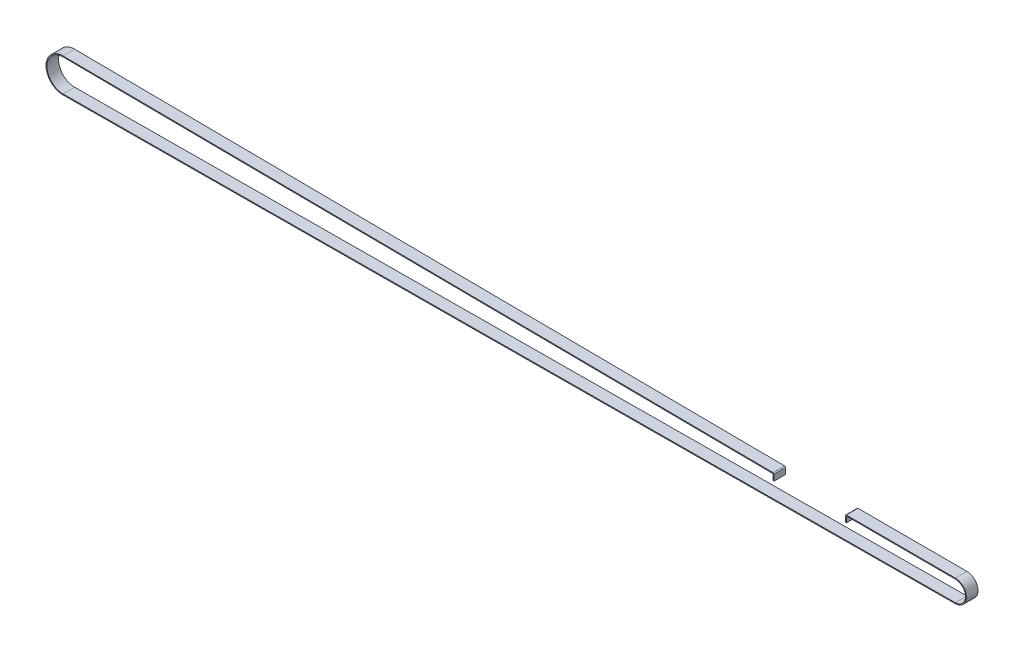
ISO-10303-21;
HEADER;
FILE_DESCRIPTION(('STEP AP214'),'2;1');
FILE_NAME('part.step','',(''),(''),'','','');
FILE_SCHEMA(('AUTOMOTIVE_DESIGN { 1 0 10303 214 1 1 1 1 }'));
ENDSEC;
DATA;
#1=APPLICATION_CONTEXT('core data for automotive mechanical design processes');
#2=APPLICATION_PROTOCOL_DEFINITION('international standard','automotive_design',2000,#1);
#3=PRODUCT_CONTEXT('',#1,'mechanical');
#4=PRODUCT('Part','Part','',(#3));
#5=PRODUCT_RELATED_PRODUCT_CATEGORY('part','',(#4));
#6=PRODUCT_DEFINITION_FORMATION('','',#4);
#7=PRODUCT_DEFINITION_CONTEXT('part definition',#1,'design');
#8=PRODUCT_DEFINITION('design','',#6,#7);
#9=PRODUCT_DEFINITION_SHAPE('','',#8);
#10=(LENGTH_UNIT() NAMED_UNIT(*) SI_UNIT(.MILLI.,.METRE.));
#11=(NAMED_UNIT(*) PLANE_ANGLE_UNIT() SI_UNIT($,.RADIAN.));
#12=(NAMED_UNIT(*) SI_UNIT($,.STERADIAN.) SOLID_ANGLE_UNIT());
#13=UNCERTAINTY_MEASURE_WITH_UNIT(LENGTH_MEASURE(1.E-05),#10,'distance_accuracy_value','');
#14=(GEOMETRIC_REPRESENTATION_CONTEXT(3) GLOBAL_UNCERTAINTY_ASSIGNED_CONTEXT((#13)) GLOBAL_UNIT_ASSIGNED_CONTEXT((#10,
#11,#12)) REPRESENTATION_CONTEXT('',''));
#15=CARTESIAN_POINT('',(0.,0.,0.));
#16=DIRECTION('',(0.,0.,1.));
#17=DIRECTION('',(1.,0.,0.));
#18=AXIS2_PLACEMENT_3D('',#15,#16,#17);
#19=CARTESIAN_POINT('',(388.165618503053,5.41097434023567,7.35));
#20=DIRECTION('',(1.,0.,0.));
#21=DIRECTION('',(0.,1.,0.));
#22=AXIS2_PLACEMENT_3D('',#19,#20,#21);
#23=PLANE('',#22);
#24=DIRECTION('',(0.,-1.,0.));
#25=VECTOR('',#24,1.);
#26=CARTESIAN_POINT('',(388.165618503053,5.41097434023567,1.));
#27=LINE('',#26,#25);
#28=CARTESIAN_POINT('',(388.165618503053,5.41097434023567,1.));
#29=VERTEX_POINT('',#28);
#30=CARTESIAN_POINT('',(388.165618503053,2.23097434023567,1.));
#31=VERTEX_POINT('',#30);
#32=EDGE_CURVE('E202',#29,#31,#27,.T.);
#33=ORIENTED_EDGE('',*,*,#32,.T.);
#34=DIRECTION('',(0.,0.,-1.));
#35=VECTOR('',#34,1.);
#36=CARTESIAN_POINT('',(388.165618503053,2.23097434023567,7.35));
#37=LINE('',#36,#35);
#38=CARTESIAN_POINT('',(388.165618503053,2.23097434023567,7.35));
#39=VERTEX_POINT('',#38);
#40=EDGE_CURVE('E11',#39,#31,#37,.T.);
#41=ORIENTED_EDGE('',*,*,#40,.F.);
#42=DIRECTION('',(0.,-1.,0.));
#43=VECTOR('',#42,1.);
#44=CARTESIAN_POINT('',(388.165618503053,5.41097434023567,7.35));
#45=LINE('',#44,#43);
#46=CARTESIAN_POINT('',(388.165618503053,5.41097434023567,7.35));
#47=VERTEX_POINT('',#46);
#48=EDGE_CURVE('E127',#47,#39,#45,.T.);
#49=ORIENTED_EDGE('',*,*,#48,.F.);
#50=DIRECTION('',(0.,0.,-1.));
#51=VECTOR('',#50,1.);
#52=CARTESIAN_POINT('',(388.165618503053,5.41097434023567,7.35));
#53=LINE('',#52,#51);
#54=EDGE_CURVE('E198',#47,#29,#53,.T.);
#55=ORIENTED_EDGE('',*,*,#54,.T.);
#56=EDGE_LOOP('',(#33,#41,#49,#55));
#57=FACE_BOUND('',#56,.T.);
#58=ADVANCED_FACE('F35',(#57),#23,.F.);
#59=CARTESIAN_POINT('',(388.665618503053,2.23097434023568,7.35));
#60=DIRECTION('',(0.,-1.,0.));
#61=DIRECTION('',(1.,0.,0.));
#62=AXIS2_PLACEMENT_3D('',#59,#60,#61);
#63=PLANE('',#62);
#64=DIRECTION('',(-1.,0.,0.));
#65=VECTOR('',#64,1.);
#66=CARTESIAN_POINT('',(388.665618503053,2.23097434023568,1.));
#67=LINE('',#66,#65);
#68=CARTESIAN_POINT('',(388.665618503053,2.23097434023568,1.));
#69=VERTEX_POINT('',#68);
#70=EDGE_CURVE('E205',#69,#31,#67,.T.);
#71=ORIENTED_EDGE('',*,*,#70,.F.);
#72=DIRECTION('',(0.,0.,-1.));
#73=VECTOR('',#72,1.);
#74=CARTESIAN_POINT('',(388.665618503053,2.23097434023568,7.35));
#75=LINE('',#74,#73);
#76=CARTESIAN_POINT('',(388.665618503053,2.23097434023568,7.35));
#77=VERTEX_POINT('',#76);
#78=EDGE_CURVE('E43',#77,#69,#75,.T.);
#79=ORIENTED_EDGE('',*,*,#78,.F.);
#80=DIRECTION('',(-1.,0.,0.));
#81=VECTOR('',#80,1.);
#82=CARTESIAN_POINT('',(388.665618503053,2.23097434023568,7.35));
#83=LINE('',#82,#81);
#84=EDGE_CURVE('E307',#77,#39,#83,.T.);
#85=ORIENTED_EDGE('',*,*,#84,.T.);
#86=ORIENTED_EDGE('',*,*,#40,.T.);
#87=EDGE_LOOP('',(#71,#79,#85,#86));
#88=FACE_BOUND('',#87,.T.);
#89=ADVANCED_FACE('F294',(#88),#63,.T.);
#90=CARTESIAN_POINT('',(388.665618503053,5.41097434023568,7.35));
#91=DIRECTION('',(1.,0.,0.));
#92=DIRECTION('',(0.,1.,0.));
#93=AXIS2_PLACEMENT_3D('',#90,#91,#92);
#94=PLANE('',#93);
#95=DIRECTION('',(0.,-1.,0.));
#96=VECTOR('',#95,1.);
#97=CARTESIAN_POINT('',(388.665618503053,5.41097434023568,1.));
#98=LINE('',#97,#96);
#99=CARTESIAN_POINT('',(388.665618503053,5.41097434023568,1.));
#100=VERTEX_POINT('',#99);
#101=EDGE_CURVE('E208',#100,#69,#98,.T.);
#102=ORIENTED_EDGE('',*,*,#101,.F.);
#103=DIRECTION('',(0.,0.,-1.));
#104=VECTOR('',#103,1.);
#105=CARTESIAN_POINT('',(388.665618503053,5.41097434023568,7.35));
#106=LINE('',#105,#104);
#107=CARTESIAN_POINT('',(388.665618503053,5.41097434023568,7.35));
#108=VERTEX_POINT('',#107);
#109=EDGE_CURVE('E284',#108,#100,#106,.T.);
#110=ORIENTED_EDGE('',*,*,#109,.F.);
#111=DIRECTION('',(0.,-1.,0.));
#112=VECTOR('',#111,1.);
#113=CARTESIAN_POINT('',(388.665618503053,5.41097434023568,7.35));
#114=LINE('',#113,#112);
#115=EDGE_CURVE('E291',#108,#77,#114,.T.);
#116=ORIENTED_EDGE('',*,*,#115,.T.);
#117=ORIENTED_EDGE('',*,*,#78,.T.);
#118=EDGE_LOOP('',(#102,#110,#116,#117));
#119=FACE_BOUND('',#118,.T.);
#120=ADVANCED_FACE('F289',(#119),#94,.T.);
#121=CARTESIAN_POINT('',(388.065618503053,5.41097434023567,7.35));
#122=DIRECTION('',(0.,0.,-1.));
#123=DIRECTION('',(-1.,0.,0.));
#124=AXIS2_PLACEMENT_3D('',#121,#122,#123);
#125=CYLINDRICAL_SURFACE('',#124,0.599999999999967);
#126=CARTESIAN_POINT('',(388.065618503053,5.41097434023567,1.));
#127=DIRECTION('',(0.,0.,1.));
#128=DIRECTION('',(1.,0.,0.));
#129=AXIS2_PLACEMENT_3D('',#126,#127,#128);
#130=CIRCLE('',#129,0.599999999999967);
#131=CARTESIAN_POINT('',(388.070626734882,6.01095343788321,1.));
#132=VERTEX_POINT('',#131);
#133=EDGE_CURVE('E211',#132,#100,#130,.F.);
#134=ORIENTED_EDGE('',*,*,#133,.F.);
#135=DIRECTION('',(0.,0.,-1.));
#136=VECTOR('',#135,1.);
#137=CARTESIAN_POINT('',(388.070626734882,6.01095343788321,7.35));
#138=LINE('',#137,#136);
#139=CARTESIAN_POINT('',(388.070626734882,6.01095343788321,7.35));
#140=VERTEX_POINT('',#139);
#141=EDGE_CURVE('E282',#140,#132,#138,.T.);
#142=ORIENTED_EDGE('',*,*,#141,.F.);
#143=CARTESIAN_POINT('',(388.065618503053,5.41097434023567,7.35));
#144=DIRECTION('',(0.,0.,1.));
#145=DIRECTION('',(1.,0.,0.));
#146=AXIS2_PLACEMENT_3D('',#143,#144,#145);
#147=CIRCLE('',#146,0.599999999999967);
#148=EDGE_CURVE('E304',#140,#108,#147,.F.);
#149=ORIENTED_EDGE('',*,*,#148,.T.);
#150=ORIENTED_EDGE('',*,*,#109,.T.);
#151=EDGE_LOOP('',(#134,#142,#149,#150));
#152=FACE_BOUND('',#151,.T.);
#153=ADVANCED_FACE('F301',(#152),#125,.T.);
#154=CARTESIAN_POINT('',(0.0640749693883614,9.24977753995013,7.35));
#155=DIRECTION('',(0.00834705304740864,0.999965162745895,0.));
#156=DIRECTION('',(-0.999965162745895,0.00834705304740864,0.));
#157=AXIS2_PLACEMENT_3D('',#154,#155,#156);
#158=PLANE('',#157);
#159=DIRECTION('',(0.999965162745895,-0.00834705304740865,0.));
#160=VECTOR('',#159,1.);
#161=CARTESIAN_POINT('',(0.0640749693883614,9.24977753995013,1.));
#162=LINE('',#161,#160);
#163=CARTESIAN_POINT('',(0.0640749730801777,9.24977807289584,1.));
#164=VERTEX_POINT('',#163);
#165=EDGE_CURVE('E214',#164,#132,#162,.T.);
#166=ORIENTED_EDGE('',*,*,#165,.F.);
#167=DIRECTION('',(0.,0.,-1.));
#168=VECTOR('',#167,1.);
#169=CARTESIAN_POINT('',(0.0640749730801777,9.24977807289584,7.35));
#170=LINE('',#169,#168);
#171=CARTESIAN_POINT('',(0.0640749730801777,9.24977807289584,7.35));
#172=VERTEX_POINT('',#171);
#173=EDGE_CURVE('E280',#172,#164,#170,.T.);
#174=ORIENTED_EDGE('',*,*,#173,.F.);
#175=DIRECTION('',(0.999965162745895,-0.00834705304740865,0.));
#176=VECTOR('',#175,1.);
#177=CARTESIAN_POINT('',(0.0640749693883614,9.24977753995013,7.35));
#178=LINE('',#177,#176);
#179=EDGE_CURVE('E309',#172,#140,#178,.T.);
#180=ORIENTED_EDGE('',*,*,#179,.T.);
#181=ORIENTED_EDGE('',*,*,#141,.T.);
#182=EDGE_LOOP('',(#166,#174,#180,#181));
#183=FACE_BOUND('',#182,.T.);
#184=ADVANCED_FACE('F375',(#183),#158,.T.);
#185=CARTESIAN_POINT('',(0.,0.,7.35));
#186=DIRECTION('',(0.,0.,-1.));
#187=DIRECTION('',(-1.,0.,0.));
#188=AXIS2_PLACEMENT_3D('',#185,#186,#187);
#189=CYLINDRICAL_SURFACE('',#188,9.25);
#190=CARTESIAN_POINT('',(0.,0.,1.));
#191=DIRECTION('',(0.,0.,1.));
#192=DIRECTION('',(1.,0.,0.));
#193=AXIS2_PLACEMENT_3D('',#190,#191,#192);
#194=CIRCLE('',#193,9.25);
#195=CARTESIAN_POINT('',(0.0575771527891216,-9.24982080212783,1.));
#196=VERTEX_POINT('',#195);
#197=EDGE_CURVE('E217',#196,#164,#194,.F.);
#198=ORIENTED_EDGE('',*,*,#197,.F.);
#199=DIRECTION('',(0.,0.,-1.));
#200=VECTOR('',#199,1.);
#201=CARTESIAN_POINT('',(0.0575771527891216,-9.24982080212783,7.35));
#202=LINE('',#201,#200);
#203=CARTESIAN_POINT('',(0.0575771527891216,-9.24982080212783,7.35));
#204=VERTEX_POINT('',#203);
#205=EDGE_CURVE('E278',#204,#196,#202,.T.);
#206=ORIENTED_EDGE('',*,*,#205,.F.);
#207=CARTESIAN_POINT('',(0.,0.,7.35));
#208=DIRECTION('',(0.,0.,1.));
#209=DIRECTION('',(1.,0.,0.));
#210=AXIS2_PLACEMENT_3D('',#207,#208,#209);
#211=CIRCLE('',#210,9.25);
#212=EDGE_CURVE('E315',#204,#172,#211,.F.);
#213=ORIENTED_EDGE('',*,*,#212,.T.);
#214=ORIENTED_EDGE('',*,*,#173,.T.);
#215=EDGE_LOOP('',(#198,#206,#213,#214));
#216=FACE_BOUND('',#215,.T.);
#217=ADVANCED_FACE('F378',(#216),#189,.T.);
#218=CARTESIAN_POINT('',(0.057577152789122,-9.24982080212783,7.35));
#219=DIRECTION('',(0.00622455705828422,-0.999980627257062,0.));
#220=DIRECTION('',(0.999980627257063,0.00622455705828422,0.));
#221=AXIS2_PLACEMENT_3D('',#218,#219,#220);
#222=PLANE('',#221);
#223=DIRECTION('',(-0.999980627257063,-0.00622455705828422,0.));
#224=VECTOR('',#223,1.);
#225=CARTESIAN_POINT('',(0.057577152789122,-9.24982080212783,1.));
#226=LINE('',#225,#224);
#227=CARTESIAN_POINT('',(487.779634680236,-6.21390821251028,1.));
#228=VERTEX_POINT('',#227);
#229=EDGE_CURVE('E220',#228,#196,#226,.T.);
#230=ORIENTED_EDGE('',*,*,#229,.F.);
#231=DIRECTION('',(0.,0.,-1.));
#232=VECTOR('',#231,1.);
#233=CARTESIAN_POINT('',(487.779634680236,-6.21390821251028,7.35));
#234=LINE('',#233,#232);
#235=CARTESIAN_POINT('',(487.779634680236,-6.21390821251028,7.35));
#236=VERTEX_POINT('',#235);
#237=EDGE_CURVE('E276',#236,#228,#234,.T.);
#238=ORIENTED_EDGE('',*,*,#237,.F.);
#239=DIRECTION('',(-0.999980627257063,-0.00622455705828422,0.));
#240=VECTOR('',#239,1.);
#241=CARTESIAN_POINT('',(0.057577152789122,-9.24982080212783,7.35));
#242=LINE('',#241,#240);
#243=EDGE_CURVE('E318',#236,#204,#242,.T.);
#244=ORIENTED_EDGE('',*,*,#243,.T.);
#245=ORIENTED_EDGE('',*,*,#205,.T.);
#246=EDGE_LOOP('',(#230,#238,#244,#245));
#247=FACE_BOUND('',#246,.T.);
#248=ADVANCED_FACE('F382',(#247),#222,.T.);
#249=CARTESIAN_POINT('',(487.74189830307,-0.15152565976434,7.35));
#250=DIRECTION('',(0.,0.,-1.));
#251=DIRECTION('',(-1.,0.,0.));
#252=AXIS2_PLACEMENT_3D('',#249,#250,#251);
#253=CYLINDRICAL_SURFACE('',#252,6.0625);
#254=CARTESIAN_POINT('',(487.74189830307,-0.15152565976434,1.));
#255=DIRECTION('',(0.,0.,1.));
#256=DIRECTION('',(1.,0.,0.));
#257=AXIS2_PLACEMENT_3D('',#254,#255,#256);
#258=CIRCLE('',#257,6.0625);
#259=CARTESIAN_POINT('',(487.78340145684,5.91083894116538,1.));
#260=VERTEX_POINT('',#259);
#261=EDGE_CURVE('E223',#260,#228,#258,.F.);
#262=ORIENTED_EDGE('',*,*,#261,.F.);
#263=DIRECTION('',(0.,0.,-1.));
#264=VECTOR('',#263,1.);
#265=CARTESIAN_POINT('',(487.78340145684,5.91083894116538,7.35));
#266=LINE('',#265,#264);
#267=CARTESIAN_POINT('',(487.78340145684,5.91083894116538,7.35));
#268=VERTEX_POINT('',#267);
#269=EDGE_CURVE('E274',#268,#260,#266,.T.);
#270=ORIENTED_EDGE('',*,*,#269,.F.);
#271=CARTESIAN_POINT('',(487.74189830307,-0.15152565976434,7.35));
#272=DIRECTION('',(0.,0.,1.));
#273=DIRECTION('',(1.,0.,0.));
#274=AXIS2_PLACEMENT_3D('',#271,#272,#273);
#275=CIRCLE('',#274,6.0625);
#276=EDGE_CURVE('E321',#268,#236,#275,.F.);
#277=ORIENTED_EDGE('',*,*,#276,.T.);
#278=ORIENTED_EDGE('',*,*,#237,.T.);
#279=EDGE_LOOP('',(#262,#270,#277,#278));
#280=FACE_BOUND('',#279,.T.);
#281=ADVANCED_FACE('F386',(#280),#253,.T.);
#282=CARTESIAN_POINT('',(428.266627977213,6.01097349103668,7.35));
#283=DIRECTION('',(0.00168245693261543,0.999998584668333,0.));
#284=DIRECTION('',(-0.999998584668333,0.00168245693261543,0.));
#285=AXIS2_PLACEMENT_3D('',#282,#283,#284);
#286=PLANE('',#285);
#287=DIRECTION('',(0.999998584668333,-0.00168245693261543,0.));
#288=VECTOR('',#287,1.);
#289=CARTESIAN_POINT('',(428.266627977213,6.01097349103668,1.));
#290=LINE('',#289,#288);
#291=CARTESIAN_POINT('',(428.266627977213,6.01097349103668,1.));
#292=VERTEX_POINT('',#291);
#293=EDGE_CURVE('E226',#292,#260,#290,.T.);
#294=ORIENTED_EDGE('',*,*,#293,.F.);
#295=DIRECTION('',(0.,0.,-1.));
#296=VECTOR('',#295,1.);
#297=CARTESIAN_POINT('',(428.266627977213,6.01097349103668,7.35));
#298=LINE('',#297,#296);
#299=CARTESIAN_POINT('',(428.266627977213,6.01097349103668,7.35));
#300=VERTEX_POINT('',#299);
#301=EDGE_CURVE('E272',#300,#292,#298,.T.);
#302=ORIENTED_EDGE('',*,*,#301,.F.);
#303=DIRECTION('',(0.999998584668333,-0.00168245693261543,0.));
#304=VECTOR('',#303,1.);
#305=CARTESIAN_POINT('',(428.266627977213,6.01097349103668,7.35));
#306=LINE('',#305,#304);
#307=EDGE_CURVE('E324',#300,#268,#306,.T.);
#308=ORIENTED_EDGE('',*,*,#307,.T.);
#309=ORIENTED_EDGE('',*,*,#269,.T.);
#310=EDGE_LOOP('',(#294,#302,#308,#309));
#311=FACE_BOUND('',#310,.T.);
#312=ADVANCED_FACE('F390',(#311),#286,.T.);
#313=CARTESIAN_POINT('',(428.265618503053,5.41097434023569,7.35));
#314=DIRECTION('',(0.,0.,-1.));
#315=DIRECTION('',(-1.,0.,0.));
#316=AXIS2_PLACEMENT_3D('',#313,#314,#315);
#317=CYLINDRICAL_SURFACE('',#316,0.599999999999994);
#318=CARTESIAN_POINT('',(428.265618503053,5.41097434023569,1.));
#319=DIRECTION('',(0.,0.,1.));
#320=DIRECTION('',(1.,0.,0.));
#321=AXIS2_PLACEMENT_3D('',#318,#319,#320);
#322=CIRCLE('',#321,0.599999999999994);
#323=CARTESIAN_POINT('',(427.665618503053,5.41097434023569,1.));
#324=VERTEX_POINT('',#323);
#325=EDGE_CURVE('E229',#324,#292,#322,.F.);
#326=ORIENTED_EDGE('',*,*,#325,.F.);
#327=DIRECTION('',(0.,0.,-1.));
#328=VECTOR('',#327,1.);
#329=CARTESIAN_POINT('',(427.665618503053,5.41097434023569,7.35));
#330=LINE('',#329,#328);
#331=CARTESIAN_POINT('',(427.665618503053,5.41097434023569,7.35));
#332=VERTEX_POINT('',#331);
#333=EDGE_CURVE('E270',#332,#324,#330,.T.);
#334=ORIENTED_EDGE('',*,*,#333,.F.);
#335=CARTESIAN_POINT('',(428.265618503053,5.41097434023569,7.35));
#336=DIRECTION('',(0.,0.,1.));
#337=DIRECTION('',(1.,0.,0.));
#338=AXIS2_PLACEMENT_3D('',#335,#336,#337);
#339=CIRCLE('',#338,0.599999999999994);
#340=EDGE_CURVE('E327',#332,#300,#339,.F.);
#341=ORIENTED_EDGE('',*,*,#340,.T.);
#342=ORIENTED_EDGE('',*,*,#301,.T.);
#343=EDGE_LOOP('',(#326,#334,#341,#342));
#344=FACE_BOUND('',#343,.T.);
#345=ADVANCED_FACE('F394',(#344),#317,.T.);
#346=CARTESIAN_POINT('',(427.665618503053,2.23097434023569,7.35));
#347=DIRECTION('',(-1.,0.,0.));
#348=DIRECTION('',(0.,0.,1.));
#349=AXIS2_PLACEMENT_3D('',#346,#347,#348);
#350=PLANE('',#349);
#351=DIRECTION('',(0.,1.,0.));
#352=VECTOR('',#351,1.);
#353=CARTESIAN_POINT('',(427.665618503053,2.23097434023569,1.));
#354=LINE('',#353,#352);
#355=CARTESIAN_POINT('',(427.665618503053,2.23097434023569,1.));
#356=VERTEX_POINT('',#355);
#357=EDGE_CURVE('E232',#356,#324,#354,.T.);
#358=ORIENTED_EDGE('',*,*,#357,.F.);
#359=DIRECTION('',(0.,0.,-1.));
#360=VECTOR('',#359,1.);
#361=CARTESIAN_POINT('',(427.665618503053,2.23097434023569,7.35));
#362=LINE('',#361,#360);
#363=CARTESIAN_POINT('',(427.665618503053,2.23097434023569,7.35));
#364=VERTEX_POINT('',#363);
#365=EDGE_CURVE('E268',#364,#356,#362,.T.);
#366=ORIENTED_EDGE('',*,*,#365,.F.);
#367=DIRECTION('',(0.,1.,0.));
#368=VECTOR('',#367,1.);
#369=CARTESIAN_POINT('',(427.665618503053,2.23097434023569,7.35));
#370=LINE('',#369,#368);
#371=EDGE_CURVE('E330',#364,#332,#370,.T.);
#372=ORIENTED_EDGE('',*,*,#371,.T.);
#373=ORIENTED_EDGE('',*,*,#333,.T.);
#374=EDGE_LOOP('',(#358,#366,#372,#373));
#375=FACE_BOUND('',#374,.T.);
#376=ADVANCED_FACE('F398',(#375),#350,.T.);
#377=CARTESIAN_POINT('',(428.165618503053,2.23097434023569,7.35));
#378=DIRECTION('',(0.,-1.,0.));
#379=DIRECTION('',(0.,0.,-1.));
#380=AXIS2_PLACEMENT_3D('',#377,#378,#379);
#381=PLANE('',#380);
#382=DIRECTION('',(-1.,0.,0.));
#383=VECTOR('',#382,1.);
#384=CARTESIAN_POINT('',(428.165618503053,2.23097434023569,1.));
#385=LINE('',#384,#383);
#386=CARTESIAN_POINT('',(428.165618503053,2.23097434023569,1.));
#387=VERTEX_POINT('',#386);
#388=EDGE_CURVE('E235',#387,#356,#385,.T.);
#389=ORIENTED_EDGE('',*,*,#388,.F.);
#390=DIRECTION('',(0.,0.,-1.));
#391=VECTOR('',#390,1.);
#392=CARTESIAN_POINT('',(428.165618503053,2.23097434023569,7.35));
#393=LINE('',#392,#391);
#394=CARTESIAN_POINT('',(428.165618503053,2.23097434023569,7.35));
#395=VERTEX_POINT('',#394);
#396=EDGE_CURVE('E266',#395,#387,#393,.T.);
#397=ORIENTED_EDGE('',*,*,#396,.F.);
#398=DIRECTION('',(-1.,0.,0.));
#399=VECTOR('',#398,1.);
#400=CARTESIAN_POINT('',(428.165618503053,2.23097434023569,7.35));
#401=LINE('',#400,#399);
#402=EDGE_CURVE('E333',#395,#364,#401,.T.);
#403=ORIENTED_EDGE('',*,*,#402,.T.);
#404=ORIENTED_EDGE('',*,*,#365,.T.);
#405=EDGE_LOOP('',(#389,#397,#403,#404));
#406=FACE_BOUND('',#405,.T.);
#407=ADVANCED_FACE('F402',(#406),#381,.T.);
#408=CARTESIAN_POINT('',(428.165618503053,2.23097434023569,7.35));
#409=DIRECTION('',(-1.,0.,0.));
#410=DIRECTION('',(0.,0.,1.));
#411=AXIS2_PLACEMENT_3D('',#408,#409,#410);
#412=PLANE('',#411);
#413=DIRECTION('',(0.,1.,0.));
#414=VECTOR('',#413,1.);
#415=CARTESIAN_POINT('',(428.165618503053,2.23097434023569,1.));
#416=LINE('',#415,#414);
#417=CARTESIAN_POINT('',(428.165618503053,5.41097434023569,1.));
#418=VERTEX_POINT('',#417);
#419=EDGE_CURVE('E238',#387,#418,#416,.T.);
#420=ORIENTED_EDGE('',*,*,#419,.T.);
#421=DIRECTION('',(0.,0.,-1.));
#422=VECTOR('',#421,1.);
#423=CARTESIAN_POINT('',(428.165618503053,5.41097434023569,7.35));
#424=LINE('',#423,#422);
#425=CARTESIAN_POINT('',(428.165618503053,5.41097434023569,7.35));
#426=VERTEX_POINT('',#425);
#427=EDGE_CURVE('E263',#426,#418,#424,.T.);
#428=ORIENTED_EDGE('',*,*,#427,.F.);
#429=DIRECTION('',(0.,1.,0.));
#430=VECTOR('',#429,1.);
#431=CARTESIAN_POINT('',(428.165618503053,2.23097434023569,7.35));
#432=LINE('',#431,#430);
#433=EDGE_CURVE('E336',#395,#426,#432,.T.);
#434=ORIENTED_EDGE('',*,*,#433,.F.);
#435=ORIENTED_EDGE('',*,*,#396,.T.);
#436=EDGE_LOOP('',(#420,#428,#434,#435));
#437=FACE_BOUND('',#436,.T.);
#438=ADVANCED_FACE('F406',(#437),#412,.F.);
#439=CARTESIAN_POINT('',(428.265618503053,5.41097434023569,7.35));
#440=DIRECTION('',(0.,0.,-1.));
#441=DIRECTION('',(-1.,0.,0.));
#442=AXIS2_PLACEMENT_3D('',#439,#440,#441);
#443=CYLINDRICAL_SURFACE('',#442,0.099999999999994);
#444=CARTESIAN_POINT('',(428.265618503053,5.41097434023569,1.));
#445=DIRECTION('',(0.,0.,-1.));
#446=DIRECTION('',(-1.,0.,0.));
#447=AXIS2_PLACEMENT_3D('',#444,#445,#446);
#448=CIRCLE('',#447,0.099999999999994);
#449=CARTESIAN_POINT('',(428.265786748746,5.51097419870252,1.));
#450=VERTEX_POINT('',#449);
#451=EDGE_CURVE('E240',#418,#450,#448,.T.);
#452=ORIENTED_EDGE('',*,*,#451,.T.);
#453=DIRECTION('',(0.,0.,-1.));
#454=VECTOR('',#453,1.);
#455=CARTESIAN_POINT('',(428.265786748746,5.51097419870252,7.35));
#456=LINE('',#455,#454);
#457=CARTESIAN_POINT('',(428.265786748746,5.51097419870252,7.35));
#458=VERTEX_POINT('',#457);
#459=EDGE_CURVE('E260',#458,#450,#456,.T.);
#460=ORIENTED_EDGE('',*,*,#459,.F.);
#461=CARTESIAN_POINT('',(428.265618503053,5.41097434023569,7.35));
#462=DIRECTION('',(0.,0.,-1.));
#463=DIRECTION('',(-1.,0.,0.));
#464=AXIS2_PLACEMENT_3D('',#461,#462,#463);
#465=CIRCLE('',#464,0.099999999999994);
#466=EDGE_CURVE('E338',#426,#458,#465,.T.);
#467=ORIENTED_EDGE('',*,*,#466,.F.);
#468=ORIENTED_EDGE('',*,*,#427,.T.);
#469=EDGE_LOOP('',(#452,#460,#467,#468));
#470=FACE_BOUND('',#469,.T.);
#471=ADVANCED_FACE('F410',(#470),#443,.F.);
#472=CARTESIAN_POINT('',(428.265786748746,5.51097419870252,7.35));
#473=DIRECTION('',(0.00168245693261543,0.999998584668333,0.));
#474=DIRECTION('',(-0.999998584668333,0.00168245693261543,0.));
#475=AXIS2_PLACEMENT_3D('',#472,#473,#474);
#476=PLANE('',#475);
#477=DIRECTION('',(0.999998584668333,-0.00168245693261543,0.));
#478=VECTOR('',#477,1.);
#479=CARTESIAN_POINT('',(428.265786748746,5.51097419870252,1.));
#480=LINE('',#479,#478);
#481=CARTESIAN_POINT('',(487.779978506034,5.41084399247401,1.));
#482=VERTEX_POINT('',#481);
#483=EDGE_CURVE('E242',#450,#482,#480,.T.);
#484=ORIENTED_EDGE('',*,*,#483,.T.);
#485=DIRECTION('',(0.,0.,-1.));
#486=VECTOR('',#485,1.);
#487=CARTESIAN_POINT('',(487.779978506034,5.41084399247401,7.35));
#488=LINE('',#487,#486);
#489=CARTESIAN_POINT('',(487.779978506034,5.41084399247401,7.35));
#490=VERTEX_POINT('',#489);
#491=EDGE_CURVE('E257',#490,#482,#488,.T.);
#492=ORIENTED_EDGE('',*,*,#491,.F.);
#493=DIRECTION('',(0.999998584668333,-0.00168245693261543,0.));
#494=VECTOR('',#493,1.);
#495=CARTESIAN_POINT('',(428.265786748746,5.51097419870252,7.35));
#496=LINE('',#495,#494);
#497=EDGE_CURVE('E340',#458,#490,#496,.T.);
#498=ORIENTED_EDGE('',*,*,#497,.F.);
#499=ORIENTED_EDGE('',*,*,#459,.T.);
#500=EDGE_LOOP('',(#484,#492,#498,#499));
#501=FACE_BOUND('',#500,.T.);
#502=ADVANCED_FACE('F414',(#501),#476,.F.);
#503=CARTESIAN_POINT('',(487.74189830307,-0.15152565976434,7.35));
#504=DIRECTION('',(0.,0.,-1.));
#505=DIRECTION('',(-1.,0.,0.));
#506=AXIS2_PLACEMENT_3D('',#503,#504,#505);
#507=CYLINDRICAL_SURFACE('',#506,5.5625);
#508=CARTESIAN_POINT('',(487.74189830307,-0.15152565976434,1.));
#509=DIRECTION('',(0.,0.,-1.));
#510=DIRECTION('',(1.,0.,0.));
#511=AXIS2_PLACEMENT_3D('',#508,#509,#510);
#512=CIRCLE('',#511,5.5625);
#513=CARTESIAN_POINT('',(487.776522401707,-5.71391789888175,1.));
#514=VERTEX_POINT('',#513);
#515=EDGE_CURVE('E244',#482,#514,#512,.T.);
#516=ORIENTED_EDGE('',*,*,#515,.T.);
#517=DIRECTION('',(0.,0.,-1.));
#518=VECTOR('',#517,1.);
#519=CARTESIAN_POINT('',(487.776522401707,-5.71391789888175,7.35));
#520=LINE('',#519,#518);
#521=CARTESIAN_POINT('',(487.776522401707,-5.71391789888175,7.35));
#522=VERTEX_POINT('',#521);
#523=EDGE_CURVE('E254',#522,#514,#520,.T.);
#524=ORIENTED_EDGE('',*,*,#523,.F.);
#525=CARTESIAN_POINT('',(487.74189830307,-0.15152565976434,7.35));
#526=DIRECTION('',(0.,0.,-1.));
#527=DIRECTION('',(1.,0.,0.));
#528=AXIS2_PLACEMENT_3D('',#525,#526,#527);
#529=CIRCLE('',#528,5.5625);
#530=EDGE_CURVE('E342',#490,#522,#529,.T.);
#531=ORIENTED_EDGE('',*,*,#530,.F.);
#532=ORIENTED_EDGE('',*,*,#491,.T.);
#533=EDGE_LOOP('',(#516,#524,#531,#532));
#534=FACE_BOUND('',#533,.T.);
#535=ADVANCED_FACE('F348',(#534),#507,.F.);
#536=CARTESIAN_POINT('',(0.0544648742599799,-8.7498304884993,7.35));
#537=DIRECTION('',(0.00622455705828422,-0.999980627257062,0.));
#538=DIRECTION('',(0.999980627257063,0.00622455705828422,0.));
#539=AXIS2_PLACEMENT_3D('',#536,#537,#538);
#540=PLANE('',#539);
#541=DIRECTION('',(-0.999980627257062,-0.00622455705828422,0.));
#542=VECTOR('',#541,1.);
#543=CARTESIAN_POINT('',(0.0544648742599799,-8.7498304884993,1.));
#544=LINE('',#543,#542);
#545=CARTESIAN_POINT('',(0.0544648742599799,-8.7498304884993,1.));
#546=VERTEX_POINT('',#545);
#547=EDGE_CURVE('E246',#514,#546,#544,.T.);
#548=ORIENTED_EDGE('',*,*,#547,.T.);
#549=DIRECTION('',(0.,0.,-1.));
#550=VECTOR('',#549,1.);
#551=CARTESIAN_POINT('',(0.0544648742599799,-8.7498304884993,7.35));
#552=LINE('',#551,#550);
#553=CARTESIAN_POINT('',(0.0544648742599799,-8.7498304884993,7.35));
#554=VERTEX_POINT('',#553);
#555=EDGE_CURVE('E193',#554,#546,#552,.T.);
#556=ORIENTED_EDGE('',*,*,#555,.F.);
#557=DIRECTION('',(-0.999980627257062,-0.00622455705828422,0.));
#558=VECTOR('',#557,1.);
#559=CARTESIAN_POINT('',(0.0544648742599799,-8.7498304884993,7.35));
#560=LINE('',#559,#558);
#561=EDGE_CURVE('E184',#522,#554,#560,.T.);
#562=ORIENTED_EDGE('',*,*,#561,.F.);
#563=ORIENTED_EDGE('',*,*,#523,.T.);
#564=EDGE_LOOP('',(#548,#556,#562,#563));
#565=FACE_BOUND('',#564,.T.);
#566=ADVANCED_FACE('F352',(#565),#540,.F.);
#567=CARTESIAN_POINT('',(0.,0.,7.35));
#568=DIRECTION('',(0.,0.,-1.));
#569=DIRECTION('',(-1.,0.,0.));
#570=AXIS2_PLACEMENT_3D('',#567,#568,#569);
#571=CYLINDRICAL_SURFACE('',#570,8.75);
#572=CARTESIAN_POINT('',(0.,0.,1.));
#573=DIRECTION('',(0.,0.,-1.));
#574=DIRECTION('',(1.,0.,0.));
#575=AXIS2_PLACEMENT_3D('',#572,#573,#574);
#576=CIRCLE('',#575,8.75);
#577=CARTESIAN_POINT('',(0.059901442864657,8.74979495857719,1.));
#578=VERTEX_POINT('',#577);
#579=EDGE_CURVE('E192',#546,#578,#576,.T.);
#580=ORIENTED_EDGE('',*,*,#579,.T.);
#581=DIRECTION('',(0.,0.,-1.));
#582=VECTOR('',#581,1.);
#583=CARTESIAN_POINT('',(0.059901442864657,8.74979495857719,7.35));
#584=LINE('',#583,#582);
#585=CARTESIAN_POINT('',(0.059901442864657,8.74979495857719,7.35));
#586=VERTEX_POINT('',#585);
#587=EDGE_CURVE('E189',#586,#578,#584,.T.);
#588=ORIENTED_EDGE('',*,*,#587,.F.);
#589=CARTESIAN_POINT('',(0.,0.,7.35));
#590=DIRECTION('',(0.,0.,-1.));
#591=DIRECTION('',(1.,0.,0.));
#592=AXIS2_PLACEMENT_3D('',#589,#590,#591);
#593=CIRCLE('',#592,8.75);
#594=EDGE_CURVE('E178',#554,#586,#593,.T.);
#595=ORIENTED_EDGE('',*,*,#594,.F.);
#596=ORIENTED_EDGE('',*,*,#555,.T.);
#597=EDGE_LOOP('',(#580,#588,#595,#596));
#598=FACE_BOUND('',#597,.T.);
#599=ADVANCED_FACE('F190',(#598),#571,.F.);
#600=CARTESIAN_POINT('',(0.059901442864657,8.74979495857719,7.35));
#601=DIRECTION('',(0.00834705304740864,0.999965162745895,0.));
#602=DIRECTION('',(-0.999965162745895,0.00834705304740865,0.));
#603=AXIS2_PLACEMENT_3D('',#600,#601,#602);
#604=PLANE('',#603);
#605=DIRECTION('',(0.999965162745895,-0.00834705304740864,0.));
#606=VECTOR('',#605,1.);
#607=CARTESIAN_POINT('',(0.059901442864657,8.74979495857719,1.));
#608=LINE('',#607,#606);
#609=CARTESIAN_POINT('',(388.066453208358,5.51097085651023,1.));
#610=VERTEX_POINT('',#609);
#611=EDGE_CURVE('E115',#578,#610,#608,.T.);
#612=ORIENTED_EDGE('',*,*,#611,.T.);
#613=DIRECTION('',(0.,0.,-1.));
#614=VECTOR('',#613,1.);
#615=CARTESIAN_POINT('',(388.066453208358,5.51097085651023,7.35));
#616=LINE('',#615,#614);
#617=CARTESIAN_POINT('',(388.066453208358,5.51097085651023,7.35));
#618=VERTEX_POINT('',#617);
#619=EDGE_CURVE('E194',#618,#610,#616,.T.);
#620=ORIENTED_EDGE('',*,*,#619,.F.);
#621=DIRECTION('',(0.999965162745895,-0.00834705304740864,0.));
#622=VECTOR('',#621,1.);
#623=CARTESIAN_POINT('',(0.059901442864657,8.74979495857719,7.35));
#624=LINE('',#623,#622);
#625=EDGE_CURVE('E182',#586,#618,#624,.T.);
#626=ORIENTED_EDGE('',*,*,#625,.F.);
#627=ORIENTED_EDGE('',*,*,#587,.T.);
#628=EDGE_LOOP('',(#612,#620,#626,#627));
#629=FACE_BOUND('',#628,.T.);
#630=ADVANCED_FACE('F196',(#629),#604,.F.);
#631=CARTESIAN_POINT('',(388.065618503053,5.41097434023567,7.35));
#632=DIRECTION('',(0.,0.,-1.));
#633=DIRECTION('',(-1.,0.,0.));
#634=AXIS2_PLACEMENT_3D('',#631,#632,#633);
#635=CYLINDRICAL_SURFACE('',#634,0.0999999999999665);
#636=CARTESIAN_POINT('',(388.065618503053,5.41097434023567,1.));
#637=DIRECTION('',(0.,0.,-1.));
#638=DIRECTION('',(-1.,0.,0.));
#639=AXIS2_PLACEMENT_3D('',#636,#637,#638);
#640=CIRCLE('',#639,0.0999999999999665);
#641=EDGE_CURVE('E121',#610,#29,#640,.T.);
#642=ORIENTED_EDGE('',*,*,#641,.T.);
#643=ORIENTED_EDGE('',*,*,#54,.F.);
#644=CARTESIAN_POINT('',(388.065618503053,5.41097434023567,7.35));
#645=DIRECTION('',(0.,0.,-1.));
#646=DIRECTION('',(-1.,0.,0.));
#647=AXIS2_PLACEMENT_3D('',#644,#645,#646);
#648=CIRCLE('',#647,0.0999999999999665);
#649=EDGE_CURVE('E51',#618,#47,#648,.T.);
#650=ORIENTED_EDGE('',*,*,#649,.F.);
#651=ORIENTED_EDGE('',*,*,#619,.T.);
#652=EDGE_LOOP('',(#642,#643,#650,#651));
#653=FACE_BOUND('',#652,.T.);
#654=ADVANCED_FACE('F354',(#653),#635,.F.);
#655=CARTESIAN_POINT('',(388.065618503053,5.41097434023567,7.35));
#656=DIRECTION('',(0.,0.,1.));
#657=DIRECTION('',(1.,0.,0.));
#658=AXIS2_PLACEMENT_3D('',#655,#656,#657);
#659=PLANE('',#658);
#660=ORIENTED_EDGE('',*,*,#48,.T.);
#661=ORIENTED_EDGE('',*,*,#84,.F.);
#662=ORIENTED_EDGE('',*,*,#115,.F.);
#663=ORIENTED_EDGE('',*,*,#148,.F.);
#664=ORIENTED_EDGE('',*,*,#179,.F.);
#665=ORIENTED_EDGE('',*,*,#212,.F.);
#666=ORIENTED_EDGE('',*,*,#243,.F.);
#667=ORIENTED_EDGE('',*,*,#276,.F.);
#668=ORIENTED_EDGE('',*,*,#307,.F.);
#669=ORIENTED_EDGE('',*,*,#340,.F.);
#670=ORIENTED_EDGE('',*,*,#371,.F.);
#671=ORIENTED_EDGE('',*,*,#402,.F.);
#672=ORIENTED_EDGE('',*,*,#433,.T.);
#673=ORIENTED_EDGE('',*,*,#466,.T.);
#674=ORIENTED_EDGE('',*,*,#497,.T.);
#675=ORIENTED_EDGE('',*,*,#530,.T.);
#676=ORIENTED_EDGE('',*,*,#561,.T.);
#677=ORIENTED_EDGE('',*,*,#594,.T.);
#678=ORIENTED_EDGE('',*,*,#625,.T.);
#679=ORIENTED_EDGE('',*,*,#649,.T.);
#680=EDGE_LOOP('',(#660,#661,#662,#663,#664,#665,#666,#667,#668,#669,#670,#671,#672,#673,#674,
#675,#676,#677,#678,#679));
#681=FACE_BOUND('',#680,.T.);
#682=ADVANCED_FACE('F180',(#681),#659,.T.);
#683=CARTESIAN_POINT('',(388.065618503053,5.41097434023567,1.));
#684=DIRECTION('',(0.,0.,1.));
#685=DIRECTION('',(1.,0.,0.));
#686=AXIS2_PLACEMENT_3D('',#683,#684,#685);
#687=PLANE('',#686);
#688=ORIENTED_EDGE('',*,*,#32,.F.);
#689=ORIENTED_EDGE('',*,*,#641,.F.);
#690=ORIENTED_EDGE('',*,*,#611,.F.);
#691=ORIENTED_EDGE('',*,*,#579,.F.);
#692=ORIENTED_EDGE('',*,*,#547,.F.);
#693=ORIENTED_EDGE('',*,*,#515,.F.);
#694=ORIENTED_EDGE('',*,*,#483,.F.);
#695=ORIENTED_EDGE('',*,*,#451,.F.);
#696=ORIENTED_EDGE('',*,*,#419,.F.);
#697=ORIENTED_EDGE('',*,*,#388,.T.);
#698=ORIENTED_EDGE('',*,*,#357,.T.);
#699=ORIENTED_EDGE('',*,*,#325,.T.);
#700=ORIENTED_EDGE('',*,*,#293,.T.);
#701=ORIENTED_EDGE('',*,*,#261,.T.);
#702=ORIENTED_EDGE('',*,*,#229,.T.);
#703=ORIENTED_EDGE('',*,*,#197,.T.);
#704=ORIENTED_EDGE('',*,*,#165,.T.);
#705=ORIENTED_EDGE('',*,*,#133,.T.);
#706=ORIENTED_EDGE('',*,*,#101,.T.);
#707=ORIENTED_EDGE('',*,*,#70,.T.);
#708=EDGE_LOOP('',(#688,#689,#690,#691,#692,#693,#694,#695,#696,#697,#698,#699,#700,#701,#702,
#703,#704,#705,#706,#707));
#709=FACE_BOUND('',#708,.T.);
#710=ADVANCED_FACE('F297',(#709),#687,.F.);
#711=CLOSED_SHELL('',(#58,#89,#120,#153,#184,#217,#248,#281,#312,#345,#376,#407,#438,#471,#502,
#535,#566,#599,#630,#654,#682,#710));
#712=MANIFOLD_SOLID_BREP('B2',#711);
#713=ADVANCED_BREP_SHAPE_REPRESENTATION('',(#18,#712),#14);
#714=SHAPE_DEFINITION_REPRESENTATION(#9,#713);
ENDSEC;
END-ISO-10303-21;
